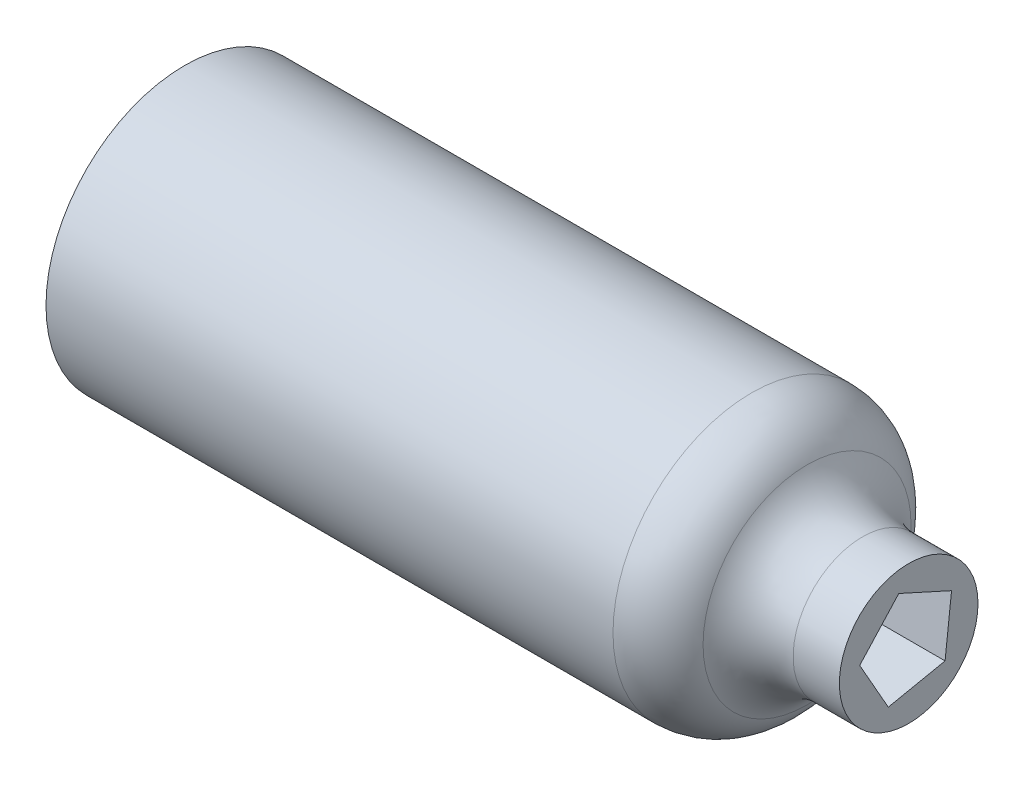
ISO-10303-21;
HEADER;
FILE_DESCRIPTION(('STEP AP214'),'2;1');
FILE_NAME('part.step','',(''),(''),'','','');
FILE_SCHEMA(('AUTOMOTIVE_DESIGN { 1 0 10303 214 1 1 1 1 }'));
ENDSEC;
DATA;
#1=APPLICATION_CONTEXT('core data for automotive mechanical design processes');
#2=APPLICATION_PROTOCOL_DEFINITION('international standard','automotive_design',2000,#1);
#3=PRODUCT_CONTEXT('',#1,'mechanical');
#4=PRODUCT('Part','Part','',(#3));
#5=PRODUCT_RELATED_PRODUCT_CATEGORY('part','',(#4));
#6=PRODUCT_DEFINITION_FORMATION('','',#4);
#7=PRODUCT_DEFINITION_CONTEXT('part definition',#1,'design');
#8=PRODUCT_DEFINITION('design','',#6,#7);
#9=PRODUCT_DEFINITION_SHAPE('','',#8);
#10=(LENGTH_UNIT() NAMED_UNIT(*) SI_UNIT(.MILLI.,.METRE.));
#11=(NAMED_UNIT(*) PLANE_ANGLE_UNIT() SI_UNIT($,.RADIAN.));
#12=(NAMED_UNIT(*) SI_UNIT($,.STERADIAN.) SOLID_ANGLE_UNIT());
#13=UNCERTAINTY_MEASURE_WITH_UNIT(LENGTH_MEASURE(1.E-05),#10,'distance_accuracy_value','');
#14=(GEOMETRIC_REPRESENTATION_CONTEXT(3) GLOBAL_UNCERTAINTY_ASSIGNED_CONTEXT((#13)) GLOBAL_UNIT_ASSIGNED_CONTEXT((#10,
#11,#12)) REPRESENTATION_CONTEXT('',''));
#15=CARTESIAN_POINT('',(0.,0.,0.));
#16=DIRECTION('',(0.,0.,1.));
#17=DIRECTION('',(1.,0.,0.));
#18=AXIS2_PLACEMENT_3D('',#15,#16,#17);
#19=CARTESIAN_POINT('',(16.,0.,0.));
#20=DIRECTION('',(-1.,0.,0.));
#21=DIRECTION('',(0.,0.,1.));
#22=AXIS2_PLACEMENT_3D('',#19,#20,#21);
#23=CYLINDRICAL_SURFACE('',#22,3.05);
#24=CARTESIAN_POINT('',(0.,0.,0.));
#25=DIRECTION('',(1.,0.,0.));
#26=DIRECTION('',(0.,0.,-1.));
#27=AXIS2_PLACEMENT_3D('',#24,#25,#26);
#28=CIRCLE('',#27,3.05);
#29=CARTESIAN_POINT('',(0.,-1.74714052096561,2.5));
#30=VERTEX_POINT('',#29);
#31=CARTESIAN_POINT('',(0.,1.74714052096561,2.5));
#32=VERTEX_POINT('',#31);
#33=EDGE_CURVE('E169',#30,#32,#28,.T.);
#34=ORIENTED_EDGE('',*,*,#33,.F.);
#35=DIRECTION('',(-1.,0.,0.));
#36=VECTOR('',#35,1.);
#37=CARTESIAN_POINT('',(16.,-1.74714052096561,2.5));
#38=LINE('',#37,#36);
#39=CARTESIAN_POINT('',(16.,-1.74714052096561,2.5));
#40=VERTEX_POINT('',#39);
#41=EDGE_CURVE('E191',#40,#30,#38,.T.);
#42=ORIENTED_EDGE('',*,*,#41,.F.);
#43=CARTESIAN_POINT('',(16.,0.,0.));
#44=DIRECTION('',(1.,0.,0.));
#45=DIRECTION('',(0.,0.,-1.));
#46=AXIS2_PLACEMENT_3D('',#43,#44,#45);
#47=CIRCLE('',#46,3.05);
#48=CARTESIAN_POINT('',(16.,1.74714052096561,2.5));
#49=VERTEX_POINT('',#48);
#50=EDGE_CURVE('E170',#40,#49,#47,.T.);
#51=ORIENTED_EDGE('',*,*,#50,.T.);
#52=DIRECTION('',(-1.,0.,0.));
#53=VECTOR('',#52,1.);
#54=CARTESIAN_POINT('',(16.,1.74714052096561,2.5));
#55=LINE('',#54,#53);
#56=EDGE_CURVE('E178',#49,#32,#55,.T.);
#57=ORIENTED_EDGE('',*,*,#56,.T.);
#58=EDGE_LOOP('',(#34,#42,#51,#57));
#59=FACE_BOUND('',#58,.T.);
#60=ADVANCED_FACE('F47',(#59),#23,.F.);
#61=CARTESIAN_POINT('',(16.,0.,2.5));
#62=DIRECTION('',(0.,0.,1.));
#63=DIRECTION('',(1.,0.,0.));
#64=AXIS2_PLACEMENT_3D('',#61,#62,#63);
#65=PLANE('',#64);
#66=DIRECTION('',(0.,1.,0.));
#67=VECTOR('',#66,1.);
#68=CARTESIAN_POINT('',(0.,0.,2.5));
#69=LINE('',#68,#67);
#70=EDGE_CURVE('E182',#30,#32,#69,.T.);
#71=ORIENTED_EDGE('',*,*,#70,.T.);
#72=ORIENTED_EDGE('',*,*,#56,.F.);
#73=DIRECTION('',(0.,1.,0.));
#74=VECTOR('',#73,1.);
#75=CARTESIAN_POINT('',(16.,0.,2.5));
#76=LINE('',#75,#74);
#77=EDGE_CURVE('E173',#40,#49,#76,.T.);
#78=ORIENTED_EDGE('',*,*,#77,.F.);
#79=ORIENTED_EDGE('',*,*,#41,.T.);
#80=EDGE_LOOP('',(#71,#72,#78,#79));
#81=FACE_BOUND('',#80,.T.);
#82=ADVANCED_FACE('F212',(#81),#65,.F.);
#83=CARTESIAN_POINT('',(16.,0.,0.));
#84=DIRECTION('',(-1.,0.,0.));
#85=DIRECTION('',(0.,0.,1.));
#86=AXIS2_PLACEMENT_3D('',#83,#84,#85);
#87=CYLINDRICAL_SURFACE('',#86,4.5);
#88=CARTESIAN_POINT('',(18.4031263575155,0.,0.));
#89=DIRECTION('',(-1.,0.,0.));
#90=DIRECTION('',(0.,0.,1.));
#91=AXIS2_PLACEMENT_3D('',#88,#89,#90);
#92=CIRCLE('',#91,4.5);
#93=CARTESIAN_POINT('',(18.4031263575155,0.,4.5));
#94=VERTEX_POINT('',#93);
#95=EDGE_CURVE('E11',#94,#94,#92,.T.);
#96=ORIENTED_EDGE('',*,*,#95,.T.);
#97=EDGE_LOOP('',(#96));
#98=FACE_BOUND('',#97,.T.);
#99=CARTESIAN_POINT('',(0.,0.,0.));
#100=DIRECTION('',(1.,0.,0.));
#101=DIRECTION('',(0.,0.,-1.));
#102=AXIS2_PLACEMENT_3D('',#99,#100,#101);
#103=CIRCLE('',#102,4.5);
#104=CARTESIAN_POINT('',(0.,0.,-4.5));
#105=VERTEX_POINT('',#104);
#106=EDGE_CURVE('E174',#105,#105,#103,.T.);
#107=ORIENTED_EDGE('',*,*,#106,.T.);
#108=EDGE_LOOP('',(#107));
#109=FACE_BOUND('',#108,.T.);
#110=ADVANCED_FACE('F219',(#98,#109),#87,.T.);
#111=CARTESIAN_POINT('',(0.,0.,0.));
#112=DIRECTION('',(1.,0.,0.));
#113=DIRECTION('',(0.,0.,-1.));
#114=AXIS2_PLACEMENT_3D('',#111,#112,#113);
#115=PLANE('',#114);
#116=ORIENTED_EDGE('',*,*,#33,.T.);
#117=ORIENTED_EDGE('',*,*,#70,.F.);
#118=EDGE_LOOP('',(#116,#117));
#119=FACE_BOUND('',#118,.T.);
#120=ORIENTED_EDGE('',*,*,#106,.F.);
#121=EDGE_LOOP('',(#120));
#122=FACE_BOUND('',#121,.T.);
#123=ADVANCED_FACE('F226',(#119,#122),#115,.F.);
#124=CARTESIAN_POINT('',(16.,0.,0.));
#125=DIRECTION('',(1.,0.,0.));
#126=DIRECTION('',(0.,0.,-1.));
#127=AXIS2_PLACEMENT_3D('',#124,#125,#126);
#128=PLANE('',#127);
#129=ORIENTED_EDGE('',*,*,#50,.F.);
#130=ORIENTED_EDGE('',*,*,#77,.T.);
#131=EDGE_LOOP('',(#129,#130));
#132=FACE_BOUND('',#131,.T.);
#133=ADVANCED_FACE('F229',(#132),#128,.F.);
#134=CARTESIAN_POINT('',(23.5,0.,0.));
#135=DIRECTION('',(1.,0.,0.));
#136=DIRECTION('',(0.,0.,-1.));
#137=AXIS2_PLACEMENT_3D('',#134,#135,#136);
#138=PLANE('',#137);
#139=CARTESIAN_POINT('',(23.5,0.,0.));
#140=DIRECTION('',(1.,0.,0.));
#141=DIRECTION('',(0.,0.,-1.));
#142=AXIS2_PLACEMENT_3D('',#139,#140,#141);
#143=CIRCLE('',#142,2.25);
#144=CARTESIAN_POINT('',(23.5,0.,-2.25));
#145=VERTEX_POINT('',#144);
#146=EDGE_CURVE('E123',#145,#145,#143,.T.);
#147=ORIENTED_EDGE('',*,*,#146,.T.);
#148=EDGE_LOOP('',(#147));
#149=FACE_BOUND('',#148,.T.);
#150=DIRECTION('',(0.,-0.738407068832873,0.674355248142731));
#151=VECTOR('',#150,1.);
#152=CARTESIAN_POINT('',(23.5,1.56734342598701,0.321612476460891));
#153=LINE('',#152,#151);
#154=CARTESIAN_POINT('',(23.5,1.56734342598701,0.321612476460891));
#155=VERTEX_POINT('',#154);
#156=CARTESIAN_POINT('',(23.5,0.178464113191886,1.59001589938674));
#157=VERTEX_POINT('',#156);
#158=EDGE_CURVE('E116',#155,#157,#153,.T.);
#159=ORIENTED_EDGE('',*,*,#158,.F.);
#160=DIRECTION('',(0.,0.413169620008031,0.910654086413946));
#161=VECTOR('',#160,1.);
#162=CARTESIAN_POINT('',(23.5,0.79020739611179,-1.39124845772789));
#163=LINE('',#162,#161);
#164=CARTESIAN_POINT('',(23.5,0.79020739611179,-1.39124845772789));
#165=VERTEX_POINT('',#164);
#166=EDGE_CURVE('E106',#165,#155,#163,.T.);
#167=ORIENTED_EDGE('',*,*,#166,.F.);
#168=DIRECTION('',(0.,0.993759937116715,-0.111540070744929));
#169=VECTOR('',#168,1.);
#170=CARTESIAN_POINT('',(23.5,-1.07896839702837,-1.1814513101326));
#171=LINE('',#170,#169);
#172=CARTESIAN_POINT('',(23.5,-1.07896839702837,-1.1814513101326));
#173=VERTEX_POINT('',#172);
#174=EDGE_CURVE('E139',#173,#165,#171,.T.);
#175=ORIENTED_EDGE('',*,*,#174,.F.);
#176=DIRECTION('',(0.,0.201007797788057,-0.97958964124188));
#177=VECTOR('',#176,1.);
#178=CARTESIAN_POINT('',(23.5,-1.45704653826231,0.661071392012849));
#179=LINE('',#178,#177);
#180=CARTESIAN_POINT('',(23.5,-1.45704653826231,0.661071392012849));
#181=VERTEX_POINT('',#180);
#182=EDGE_CURVE('E133',#181,#173,#179,.T.);
#183=ORIENTED_EDGE('',*,*,#182,.F.);
#184=DIRECTION('',(0.,-0.869530286079929,-0.493879622569869));
#185=VECTOR('',#184,1.);
#186=CARTESIAN_POINT('',(23.5,0.178464113191886,1.59001589938674));
#187=LINE('',#186,#185);
#188=EDGE_CURVE('E129',#157,#181,#187,.T.);
#189=ORIENTED_EDGE('',*,*,#188,.F.);
#190=EDGE_LOOP('',(#159,#167,#175,#183,#189));
#191=FACE_BOUND('',#190,.T.);
#192=ADVANCED_FACE('F127',(#149,#191),#138,.T.);
#193=CARTESIAN_POINT('',(23.5,0.,0.));
#194=DIRECTION('',(-1.,0.,0.));
#195=DIRECTION('',(0.,0.,1.));
#196=AXIS2_PLACEMENT_3D('',#193,#194,#195);
#197=CYLINDRICAL_SURFACE('',#196,2.25);
#198=CARTESIAN_POINT('',(22.,0.,0.));
#199=DIRECTION('',(1.,0.,0.));
#200=DIRECTION('',(0.,0.,-1.));
#201=AXIS2_PLACEMENT_3D('',#198,#199,#200);
#202=CIRCLE('',#201,2.25);
#203=CARTESIAN_POINT('',(22.,0.,-2.25));
#204=VERTEX_POINT('',#203);
#205=EDGE_CURVE('E194',#204,#204,#202,.T.);
#206=ORIENTED_EDGE('',*,*,#205,.T.);
#207=EDGE_LOOP('',(#206));
#208=FACE_BOUND('',#207,.T.);
#209=ORIENTED_EDGE('',*,*,#146,.F.);
#210=EDGE_LOOP('',(#209));
#211=FACE_BOUND('',#210,.T.);
#212=ADVANCED_FACE('F237',(#208,#211),#197,.T.);
#213=CARTESIAN_POINT('',(23.5,0.79020739611179,-1.39124845772789));
#214=DIRECTION('',(0.,-0.910654086413946,0.413169620008031));
#215=DIRECTION('',(0.,-0.413169620008031,-0.910654086413947));
#216=AXIS2_PLACEMENT_3D('',#213,#214,#215);
#217=PLANE('',#216);
#218=DIRECTION('',(0.,0.413169620008031,0.910654086413946));
#219=VECTOR('',#218,1.);
#220=CARTESIAN_POINT('',(20.,0.79020739611179,-1.39124845772789));
#221=LINE('',#220,#219);
#222=CARTESIAN_POINT('',(20.,0.79020739611179,-1.39124845772789));
#223=VERTEX_POINT('',#222);
#224=CARTESIAN_POINT('',(20.,1.56734342598701,0.321612476460891));
#225=VERTEX_POINT('',#224);
#226=EDGE_CURVE('E63',#223,#225,#221,.T.);
#227=ORIENTED_EDGE('',*,*,#226,.F.);
#228=DIRECTION('',(-1.,0.,0.));
#229=VECTOR('',#228,1.);
#230=CARTESIAN_POINT('',(23.5,0.79020739611179,-1.39124845772789));
#231=LINE('',#230,#229);
#232=EDGE_CURVE('E111',#165,#223,#231,.T.);
#233=ORIENTED_EDGE('',*,*,#232,.F.);
#234=ORIENTED_EDGE('',*,*,#166,.T.);
#235=DIRECTION('',(-1.,0.,0.));
#236=VECTOR('',#235,1.);
#237=CARTESIAN_POINT('',(23.5,1.56734342598701,0.321612476460891));
#238=LINE('',#237,#236);
#239=EDGE_CURVE('E109',#155,#225,#238,.T.);
#240=ORIENTED_EDGE('',*,*,#239,.T.);
#241=EDGE_LOOP('',(#227,#233,#234,#240));
#242=FACE_BOUND('',#241,.T.);
#243=ADVANCED_FACE('F108',(#242),#217,.T.);
#244=CARTESIAN_POINT('',(23.5,1.56734342598701,0.321612476460891));
#245=DIRECTION('',(0.,-0.674355248142731,-0.738407068832873));
#246=DIRECTION('',(0.,0.738407068832873,-0.674355248142732));
#247=AXIS2_PLACEMENT_3D('',#244,#245,#246);
#248=PLANE('',#247);
#249=DIRECTION('',(0.,-0.738407068832873,0.674355248142731));
#250=VECTOR('',#249,1.);
#251=CARTESIAN_POINT('',(20.,1.56734342598701,0.321612476460891));
#252=LINE('',#251,#250);
#253=CARTESIAN_POINT('',(20.,0.178464113191886,1.59001589938674));
#254=VERTEX_POINT('',#253);
#255=EDGE_CURVE('E67',#225,#254,#252,.T.);
#256=ORIENTED_EDGE('',*,*,#255,.F.);
#257=ORIENTED_EDGE('',*,*,#239,.F.);
#258=ORIENTED_EDGE('',*,*,#158,.T.);
#259=DIRECTION('',(-1.,0.,0.));
#260=VECTOR('',#259,1.);
#261=CARTESIAN_POINT('',(23.5,0.178464113191886,1.59001589938674));
#262=LINE('',#261,#260);
#263=EDGE_CURVE('E124',#157,#254,#262,.T.);
#264=ORIENTED_EDGE('',*,*,#263,.T.);
#265=EDGE_LOOP('',(#256,#257,#258,#264));
#266=FACE_BOUND('',#265,.T.);
#267=ADVANCED_FACE('F120',(#266),#248,.T.);
#268=CARTESIAN_POINT('',(23.5,0.178464113191886,1.59001589938674));
#269=DIRECTION('',(0.,0.493879622569869,-0.869530286079929));
#270=DIRECTION('',(0.,0.869530286079929,0.493879622569869));
#271=AXIS2_PLACEMENT_3D('',#268,#269,#270);
#272=PLANE('',#271);
#273=DIRECTION('',(0.,-0.869530286079929,-0.493879622569869));
#274=VECTOR('',#273,1.);
#275=CARTESIAN_POINT('',(20.,0.178464113191886,1.59001589938674));
#276=LINE('',#275,#274);
#277=CARTESIAN_POINT('',(20.,-1.45704653826231,0.661071392012849));
#278=VERTEX_POINT('',#277);
#279=EDGE_CURVE('E146',#254,#278,#276,.T.);
#280=ORIENTED_EDGE('',*,*,#279,.F.);
#281=ORIENTED_EDGE('',*,*,#263,.F.);
#282=ORIENTED_EDGE('',*,*,#188,.T.);
#283=DIRECTION('',(-1.,0.,0.));
#284=VECTOR('',#283,1.);
#285=CARTESIAN_POINT('',(23.5,-1.45704653826231,0.661071392012849));
#286=LINE('',#285,#284);
#287=EDGE_CURVE('E160',#181,#278,#286,.T.);
#288=ORIENTED_EDGE('',*,*,#287,.T.);
#289=EDGE_LOOP('',(#280,#281,#282,#288));
#290=FACE_BOUND('',#289,.T.);
#291=ADVANCED_FACE('F248',(#290),#272,.T.);
#292=CARTESIAN_POINT('',(23.5,-1.45704653826231,0.661071392012849));
#293=DIRECTION('',(0.,0.97958964124188,0.201007797788057));
#294=DIRECTION('',(0.,-0.201007797788057,0.97958964124188));
#295=AXIS2_PLACEMENT_3D('',#292,#293,#294);
#296=PLANE('',#295);
#297=DIRECTION('',(0.,0.201007797788057,-0.97958964124188));
#298=VECTOR('',#297,1.);
#299=CARTESIAN_POINT('',(20.,-1.45704653826231,0.661071392012849));
#300=LINE('',#299,#298);
#301=CARTESIAN_POINT('',(20.,-1.07896839702837,-1.1814513101326));
#302=VERTEX_POINT('',#301);
#303=EDGE_CURVE('E149',#278,#302,#300,.T.);
#304=ORIENTED_EDGE('',*,*,#303,.F.);
#305=ORIENTED_EDGE('',*,*,#287,.F.);
#306=ORIENTED_EDGE('',*,*,#182,.T.);
#307=DIRECTION('',(-1.,0.,0.));
#308=VECTOR('',#307,1.);
#309=CARTESIAN_POINT('',(23.5,-1.07896839702837,-1.1814513101326));
#310=LINE('',#309,#308);
#311=EDGE_CURVE('E156',#173,#302,#310,.T.);
#312=ORIENTED_EDGE('',*,*,#311,.T.);
#313=EDGE_LOOP('',(#304,#305,#306,#312));
#314=FACE_BOUND('',#313,.T.);
#315=ADVANCED_FACE('F251',(#314),#296,.T.);
#316=CARTESIAN_POINT('',(23.5,-1.07896839702837,-1.1814513101326));
#317=DIRECTION('',(0.,0.111540070744929,0.993759937116715));
#318=DIRECTION('',(0.,-0.993759937116715,0.111540070744929));
#319=AXIS2_PLACEMENT_3D('',#316,#317,#318);
#320=PLANE('',#319);
#321=DIRECTION('',(0.,0.993759937116715,-0.111540070744929));
#322=VECTOR('',#321,1.);
#323=CARTESIAN_POINT('',(20.,-1.07896839702837,-1.1814513101326));
#324=LINE('',#323,#322);
#325=EDGE_CURVE('E117',#302,#223,#324,.T.);
#326=ORIENTED_EDGE('',*,*,#325,.F.);
#327=ORIENTED_EDGE('',*,*,#311,.F.);
#328=ORIENTED_EDGE('',*,*,#174,.T.);
#329=ORIENTED_EDGE('',*,*,#232,.T.);
#330=EDGE_LOOP('',(#326,#327,#328,#329));
#331=FACE_BOUND('',#330,.T.);
#332=ADVANCED_FACE('F236',(#331),#320,.T.);
#333=CARTESIAN_POINT('',(20.,0.,0.));
#334=DIRECTION('',(1.,0.,0.));
#335=DIRECTION('',(0.,0.,-1.));
#336=AXIS2_PLACEMENT_3D('',#333,#334,#335);
#337=PLANE('',#336);
#338=ORIENTED_EDGE('',*,*,#226,.T.);
#339=ORIENTED_EDGE('',*,*,#255,.T.);
#340=ORIENTED_EDGE('',*,*,#279,.T.);
#341=ORIENTED_EDGE('',*,*,#303,.T.);
#342=ORIENTED_EDGE('',*,*,#325,.T.);
#343=EDGE_LOOP('',(#338,#339,#340,#341,#342));
#344=FACE_BOUND('',#343,.T.);
#345=ADVANCED_FACE('F209',(#344),#337,.T.);
#346=CARTESIAN_POINT('',(22.,0.,0.));
#347=DIRECTION('',(1.,0.,0.));
#348=DIRECTION('',(0.,0.,-1.));
#349=AXIS2_PLACEMENT_3D('',#346,#347,#348);
#350=TOROIDAL_SURFACE('',#349,4.25,2.);
#351=CARTESIAN_POINT('',(20.2015631787577,0.,0.));
#352=DIRECTION('',(1.,0.,0.));
#353=DIRECTION('',(0.,0.,-1.));
#354=AXIS2_PLACEMENT_3D('',#351,#352,#353);
#355=CIRCLE('',#354,3.375);
#356=CARTESIAN_POINT('',(20.2015631787577,0.,-3.375));
#357=VERTEX_POINT('',#356);
#358=EDGE_CURVE('E56',#357,#357,#355,.T.);
#359=ORIENTED_EDGE('',*,*,#358,.T.);
#360=EDGE_LOOP('',(#359));
#361=FACE_BOUND('',#360,.T.);
#362=ORIENTED_EDGE('',*,*,#205,.F.);
#363=EDGE_LOOP('',(#362));
#364=FACE_BOUND('',#363,.T.);
#365=ADVANCED_FACE('F201',(#361,#364),#350,.F.);
#366=CARTESIAN_POINT('',(18.4031263575155,0.,0.));
#367=DIRECTION('',(-1.,0.,0.));
#368=DIRECTION('',(0.,0.,1.));
#369=AXIS2_PLACEMENT_3D('',#366,#367,#368);
#370=TOROIDAL_SURFACE('',#369,2.5,2.);
#371=ORIENTED_EDGE('',*,*,#95,.F.);
#372=EDGE_LOOP('',(#371));
#373=FACE_BOUND('',#372,.T.);
#374=ORIENTED_EDGE('',*,*,#358,.F.);
#375=EDGE_LOOP('',(#374));
#376=FACE_BOUND('',#375,.T.);
#377=ADVANCED_FACE('F49',(#373,#376),#370,.T.);
#378=CLOSED_SHELL('',(#60,#82,#110,#123,#133,#192,#212,#243,#267,#291,#315,#332,#345,#365,#377));
#379=MANIFOLD_SOLID_BREP('B2',#378);
#380=ADVANCED_BREP_SHAPE_REPRESENTATION('',(#18,#379),#14);
#381=SHAPE_DEFINITION_REPRESENTATION(#9,#380);
ENDSEC;
END-ISO-10303-21;
